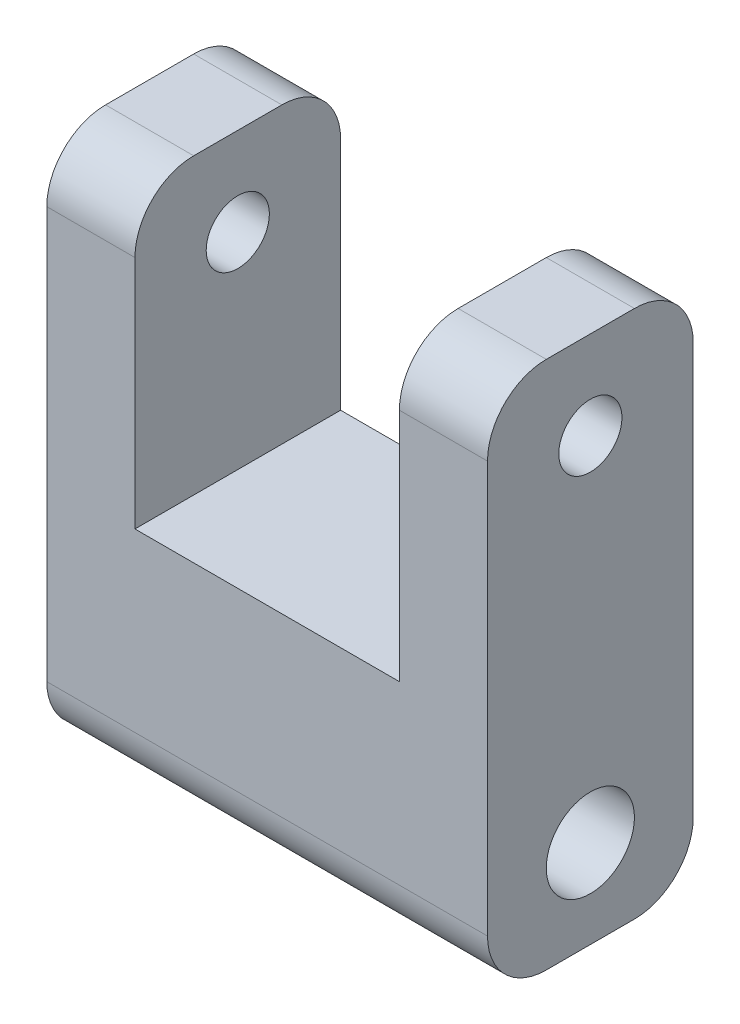
ISO-10303-21;
HEADER;
FILE_DESCRIPTION(('STEP AP214'),'2;1');
FILE_NAME('part.step','',(''),(''),'','','');
FILE_SCHEMA(('AUTOMOTIVE_DESIGN { 1 0 10303 214 1 1 1 1 }'));
ENDSEC;
DATA;
#1=APPLICATION_CONTEXT('core data for automotive mechanical design processes');
#2=APPLICATION_PROTOCOL_DEFINITION('international standard','automotive_design',2000,#1);
#3=PRODUCT_CONTEXT('',#1,'mechanical');
#4=PRODUCT('Part','Part','',(#3));
#5=PRODUCT_RELATED_PRODUCT_CATEGORY('part','',(#4));
#6=PRODUCT_DEFINITION_FORMATION('','',#4);
#7=PRODUCT_DEFINITION_CONTEXT('part definition',#1,'design');
#8=PRODUCT_DEFINITION('design','',#6,#7);
#9=PRODUCT_DEFINITION_SHAPE('','',#8);
#10=(LENGTH_UNIT() NAMED_UNIT(*) SI_UNIT(.MILLI.,.METRE.));
#11=(NAMED_UNIT(*) PLANE_ANGLE_UNIT() SI_UNIT($,.RADIAN.));
#12=(NAMED_UNIT(*) SI_UNIT($,.STERADIAN.) SOLID_ANGLE_UNIT());
#13=UNCERTAINTY_MEASURE_WITH_UNIT(LENGTH_MEASURE(1.E-05),#10,'distance_accuracy_value','');
#14=(GEOMETRIC_REPRESENTATION_CONTEXT(3) GLOBAL_UNCERTAINTY_ASSIGNED_CONTEXT((#13)) GLOBAL_UNIT_ASSIGNED_CONTEXT((#10,
#11,#12)) REPRESENTATION_CONTEXT('',''));
#15=CARTESIAN_POINT('',(0.,0.,0.));
#16=DIRECTION('',(0.,0.,1.));
#17=DIRECTION('',(1.,0.,0.));
#18=AXIS2_PLACEMENT_3D('',#15,#16,#17);
#19=CARTESIAN_POINT('',(0.,16.,6.));
#20=DIRECTION('',(1.,0.,0.));
#21=DIRECTION('',(0.,0.,-1.));
#22=AXIS2_PLACEMENT_3D('',#19,#20,#21);
#23=CYLINDRICAL_SURFACE('',#22,2.);
#24=DIRECTION('',(1.,0.,0.));
#25=VECTOR('',#24,1.);
#26=CARTESIAN_POINT('',(0.,16.,4.));
#27=LINE('',#26,#25);
#28=CARTESIAN_POINT('',(0.,16.,4.));
#29=VERTEX_POINT('',#28);
#30=CARTESIAN_POINT('',(3.,16.,4.));
#31=VERTEX_POINT('',#30);
#32=EDGE_CURVE('E259',#29,#31,#27,.T.);
#33=ORIENTED_EDGE('',*,*,#32,.F.);
#34=CARTESIAN_POINT('',(0.,16.,6.));
#35=DIRECTION('',(1.,0.,0.));
#36=DIRECTION('',(0.,0.,-1.));
#37=AXIS2_PLACEMENT_3D('',#34,#35,#36);
#38=CIRCLE('',#37,2.);
#39=CARTESIAN_POINT('',(0.,18.,6.));
#40=VERTEX_POINT('',#39);
#41=EDGE_CURVE('E42',#40,#29,#38,.F.);
#42=ORIENTED_EDGE('',*,*,#41,.F.);
#43=DIRECTION('',(1.,0.,0.));
#44=VECTOR('',#43,1.);
#45=CARTESIAN_POINT('',(0.,18.,6.));
#46=LINE('',#45,#44);
#47=CARTESIAN_POINT('',(3.,18.,6.));
#48=VERTEX_POINT('',#47);
#49=EDGE_CURVE('E262',#48,#40,#46,.F.);
#50=ORIENTED_EDGE('',*,*,#49,.F.);
#51=CARTESIAN_POINT('',(3.,16.,6.));
#52=DIRECTION('',(-1.,0.,0.));
#53=DIRECTION('',(0.,-1.,0.));
#54=AXIS2_PLACEMENT_3D('',#51,#52,#53);
#55=CIRCLE('',#54,2.);
#56=EDGE_CURVE('E11',#31,#48,#55,.F.);
#57=ORIENTED_EDGE('',*,*,#56,.F.);
#58=EDGE_LOOP('',(#33,#42,#50,#57));
#59=FACE_BOUND('',#58,.T.);
#60=ADVANCED_FACE('F35',(#59),#23,.T.);
#61=CARTESIAN_POINT('',(0.,16.,6.));
#62=DIRECTION('',(1.,0.,0.));
#63=DIRECTION('',(0.,0.,-1.));
#64=AXIS2_PLACEMENT_3D('',#61,#62,#63);
#65=CYLINDRICAL_SURFACE('',#64,2.);
#66=DIRECTION('',(1.,0.,0.));
#67=VECTOR('',#66,1.);
#68=CARTESIAN_POINT('',(0.,16.,4.));
#69=LINE('',#68,#67);
#70=CARTESIAN_POINT('',(12.,16.,4.));
#71=VERTEX_POINT('',#70);
#72=CARTESIAN_POINT('',(15.,16.,4.));
#73=VERTEX_POINT('',#72);
#74=EDGE_CURVE('E249',#71,#73,#69,.T.);
#75=ORIENTED_EDGE('',*,*,#74,.F.);
#76=CARTESIAN_POINT('',(12.,16.,6.));
#77=DIRECTION('',(1.,0.,0.));
#78=DIRECTION('',(0.,0.,-1.));
#79=AXIS2_PLACEMENT_3D('',#76,#77,#78);
#80=CIRCLE('',#79,2.);
#81=CARTESIAN_POINT('',(12.,18.,6.));
#82=VERTEX_POINT('',#81);
#83=EDGE_CURVE('E255',#82,#71,#80,.F.);
#84=ORIENTED_EDGE('',*,*,#83,.F.);
#85=DIRECTION('',(1.,0.,0.));
#86=VECTOR('',#85,1.);
#87=CARTESIAN_POINT('',(0.,18.,6.));
#88=LINE('',#87,#86);
#89=CARTESIAN_POINT('',(15.,18.,6.));
#90=VERTEX_POINT('',#89);
#91=EDGE_CURVE('E252',#90,#82,#88,.F.);
#92=ORIENTED_EDGE('',*,*,#91,.F.);
#93=CARTESIAN_POINT('',(15.,16.,6.));
#94=DIRECTION('',(-1.,0.,0.));
#95=DIRECTION('',(0.,-1.,0.));
#96=AXIS2_PLACEMENT_3D('',#93,#94,#95);
#97=CIRCLE('',#96,2.);
#98=EDGE_CURVE('E257',#73,#90,#97,.F.);
#99=ORIENTED_EDGE('',*,*,#98,.F.);
#100=EDGE_LOOP('',(#75,#84,#92,#99));
#101=FACE_BOUND('',#100,.T.);
#102=ADVANCED_FACE('F308',(#101),#65,.T.);
#103=CARTESIAN_POINT('',(0.,16.,9.));
#104=DIRECTION('',(-1.,0.,0.));
#105=DIRECTION('',(0.,0.,1.));
#106=AXIS2_PLACEMENT_3D('',#103,#104,#105);
#107=CYLINDRICAL_SURFACE('',#106,2.);
#108=DIRECTION('',(-1.,0.,0.));
#109=VECTOR('',#108,1.);
#110=CARTESIAN_POINT('',(0.,16.,11.));
#111=LINE('',#110,#109);
#112=CARTESIAN_POINT('',(15.,16.,11.));
#113=VERTEX_POINT('',#112);
#114=CARTESIAN_POINT('',(12.,16.,11.));
#115=VERTEX_POINT('',#114);
#116=EDGE_CURVE('E239',#113,#115,#111,.T.);
#117=ORIENTED_EDGE('',*,*,#116,.F.);
#118=CARTESIAN_POINT('',(15.,16.,9.));
#119=DIRECTION('',(-1.,0.,0.));
#120=DIRECTION('',(0.,-1.,0.));
#121=AXIS2_PLACEMENT_3D('',#118,#119,#120);
#122=CIRCLE('',#121,2.);
#123=CARTESIAN_POINT('',(15.,18.,9.));
#124=VERTEX_POINT('',#123);
#125=EDGE_CURVE('E244',#124,#113,#122,.F.);
#126=ORIENTED_EDGE('',*,*,#125,.F.);
#127=DIRECTION('',(-1.,0.,0.));
#128=VECTOR('',#127,1.);
#129=CARTESIAN_POINT('',(0.,18.,9.));
#130=LINE('',#129,#128);
#131=CARTESIAN_POINT('',(12.,18.,9.));
#132=VERTEX_POINT('',#131);
#133=EDGE_CURVE('E241',#132,#124,#130,.F.);
#134=ORIENTED_EDGE('',*,*,#133,.F.);
#135=CARTESIAN_POINT('',(12.,16.,9.));
#136=DIRECTION('',(1.,0.,0.));
#137=DIRECTION('',(0.,0.,-1.));
#138=AXIS2_PLACEMENT_3D('',#135,#136,#137);
#139=CIRCLE('',#138,2.);
#140=EDGE_CURVE('E246',#115,#132,#139,.F.);
#141=ORIENTED_EDGE('',*,*,#140,.F.);
#142=EDGE_LOOP('',(#117,#126,#134,#141));
#143=FACE_BOUND('',#142,.T.);
#144=ADVANCED_FACE('F313',(#143),#107,.T.);
#145=CARTESIAN_POINT('',(0.,16.,9.));
#146=DIRECTION('',(1.,0.,0.));
#147=DIRECTION('',(0.,0.,-1.));
#148=AXIS2_PLACEMENT_3D('',#145,#146,#147);
#149=CYLINDRICAL_SURFACE('',#148,2.);
#150=DIRECTION('',(1.,0.,0.));
#151=VECTOR('',#150,1.);
#152=CARTESIAN_POINT('',(0.,18.,9.));
#153=LINE('',#152,#151);
#154=CARTESIAN_POINT('',(0.,18.,9.));
#155=VERTEX_POINT('',#154);
#156=CARTESIAN_POINT('',(3.,18.,9.));
#157=VERTEX_POINT('',#156);
#158=EDGE_CURVE('E231',#155,#157,#153,.T.);
#159=ORIENTED_EDGE('',*,*,#158,.F.);
#160=CARTESIAN_POINT('',(0.,16.,9.));
#161=DIRECTION('',(1.,0.,0.));
#162=DIRECTION('',(0.,0.,-1.));
#163=AXIS2_PLACEMENT_3D('',#160,#161,#162);
#164=CIRCLE('',#163,2.);
#165=CARTESIAN_POINT('',(0.,16.,11.));
#166=VERTEX_POINT('',#165);
#167=EDGE_CURVE('E237',#166,#155,#164,.F.);
#168=ORIENTED_EDGE('',*,*,#167,.F.);
#169=DIRECTION('',(1.,0.,0.));
#170=VECTOR('',#169,1.);
#171=CARTESIAN_POINT('',(0.,16.,11.));
#172=LINE('',#171,#170);
#173=CARTESIAN_POINT('',(3.,16.,11.));
#174=VERTEX_POINT('',#173);
#175=EDGE_CURVE('E235',#174,#166,#172,.F.);
#176=ORIENTED_EDGE('',*,*,#175,.F.);
#177=CARTESIAN_POINT('',(3.,16.,9.));
#178=DIRECTION('',(-1.,0.,0.));
#179=DIRECTION('',(0.,-1.,0.));
#180=AXIS2_PLACEMENT_3D('',#177,#178,#179);
#181=CIRCLE('',#180,2.);
#182=EDGE_CURVE('E137',#157,#174,#181,.F.);
#183=ORIENTED_EDGE('',*,*,#182,.F.);
#184=EDGE_LOOP('',(#159,#168,#176,#183));
#185=FACE_BOUND('',#184,.T.);
#186=ADVANCED_FACE('F287',(#185),#149,.T.);
#187=CARTESIAN_POINT('',(0.,2.,6.));
#188=DIRECTION('',(-1.,0.,0.));
#189=DIRECTION('',(0.,0.,1.));
#190=AXIS2_PLACEMENT_3D('',#187,#188,#189);
#191=CYLINDRICAL_SURFACE('',#190,2.);
#192=DIRECTION('',(-1.,0.,0.));
#193=VECTOR('',#192,1.);
#194=CARTESIAN_POINT('',(0.,2.,4.));
#195=LINE('',#194,#193);
#196=CARTESIAN_POINT('',(15.,2.,4.));
#197=VERTEX_POINT('',#196);
#198=CARTESIAN_POINT('',(0.,2.,4.));
#199=VERTEX_POINT('',#198);
#200=EDGE_CURVE('E220',#197,#199,#195,.T.);
#201=ORIENTED_EDGE('',*,*,#200,.F.);
#202=CARTESIAN_POINT('',(15.,2.,6.));
#203=DIRECTION('',(-1.,0.,0.));
#204=DIRECTION('',(0.,-1.,0.));
#205=AXIS2_PLACEMENT_3D('',#202,#203,#204);
#206=CIRCLE('',#205,2.);
#207=CARTESIAN_POINT('',(15.,0.,6.));
#208=VERTEX_POINT('',#207);
#209=EDGE_CURVE('E226',#208,#197,#206,.F.);
#210=ORIENTED_EDGE('',*,*,#209,.F.);
#211=DIRECTION('',(-1.,0.,0.));
#212=VECTOR('',#211,1.);
#213=CARTESIAN_POINT('',(20.,0.,6.));
#214=LINE('',#213,#212);
#215=CARTESIAN_POINT('',(0.,0.,6.));
#216=VERTEX_POINT('',#215);
#217=EDGE_CURVE('E223',#216,#208,#214,.F.);
#218=ORIENTED_EDGE('',*,*,#217,.F.);
#219=CARTESIAN_POINT('',(0.,2.,6.));
#220=DIRECTION('',(1.,0.,0.));
#221=DIRECTION('',(0.,0.,-1.));
#222=AXIS2_PLACEMENT_3D('',#219,#220,#221);
#223=CIRCLE('',#222,2.);
#224=EDGE_CURVE('E229',#199,#216,#223,.F.);
#225=ORIENTED_EDGE('',*,*,#224,.F.);
#226=EDGE_LOOP('',(#201,#210,#218,#225));
#227=FACE_BOUND('',#226,.T.);
#228=ADVANCED_FACE('F273',(#227),#191,.T.);
#229=CARTESIAN_POINT('',(0.,2.,9.));
#230=DIRECTION('',(1.,0.,0.));
#231=DIRECTION('',(0.,0.,-1.));
#232=AXIS2_PLACEMENT_3D('',#229,#230,#231);
#233=CYLINDRICAL_SURFACE('',#232,2.);
#234=DIRECTION('',(1.,0.,0.));
#235=VECTOR('',#234,1.);
#236=CARTESIAN_POINT('',(0.,2.,11.));
#237=LINE('',#236,#235);
#238=CARTESIAN_POINT('',(0.,2.,11.));
#239=VERTEX_POINT('',#238);
#240=CARTESIAN_POINT('',(15.,2.,11.));
#241=VERTEX_POINT('',#240);
#242=EDGE_CURVE('E203',#239,#241,#237,.T.);
#243=ORIENTED_EDGE('',*,*,#242,.F.);
#244=CARTESIAN_POINT('',(0.,2.,9.));
#245=DIRECTION('',(1.,0.,0.));
#246=DIRECTION('',(0.,0.,-1.));
#247=AXIS2_PLACEMENT_3D('',#244,#245,#246);
#248=CIRCLE('',#247,2.);
#249=CARTESIAN_POINT('',(0.,0.,9.));
#250=VERTEX_POINT('',#249);
#251=EDGE_CURVE('E215',#250,#239,#248,.F.);
#252=ORIENTED_EDGE('',*,*,#251,.F.);
#253=DIRECTION('',(1.,0.,0.));
#254=VECTOR('',#253,1.);
#255=CARTESIAN_POINT('',(20.,0.,9.));
#256=LINE('',#255,#254);
#257=CARTESIAN_POINT('',(15.,0.,9.));
#258=VERTEX_POINT('',#257);
#259=EDGE_CURVE('E212',#258,#250,#256,.F.);
#260=ORIENTED_EDGE('',*,*,#259,.F.);
#261=CARTESIAN_POINT('',(15.,2.,9.));
#262=DIRECTION('',(-1.,0.,0.));
#263=DIRECTION('',(0.,-1.,0.));
#264=AXIS2_PLACEMENT_3D('',#261,#262,#263);
#265=CIRCLE('',#264,2.);
#266=EDGE_CURVE('E217',#241,#258,#265,.F.);
#267=ORIENTED_EDGE('',*,*,#266,.F.);
#268=EDGE_LOOP('',(#243,#252,#260,#267));
#269=FACE_BOUND('',#268,.T.);
#270=ADVANCED_FACE('F283',(#269),#233,.T.);
#271=CARTESIAN_POINT('',(0.,18.,15.));
#272=DIRECTION('',(0.,-1.,0.));
#273=DIRECTION('',(0.,0.,-1.));
#274=AXIS2_PLACEMENT_3D('',#271,#272,#273);
#275=PLANE('',#274);
#276=DIRECTION('',(0.,0.,1.));
#277=VECTOR('',#276,1.);
#278=CARTESIAN_POINT('',(15.,18.,-9.));
#279=LINE('',#278,#277);
#280=EDGE_CURVE('E176',#90,#124,#279,.T.);
#281=ORIENTED_EDGE('',*,*,#280,.F.);
#282=ORIENTED_EDGE('',*,*,#91,.T.);
#283=DIRECTION('',(0.,0.,1.));
#284=VECTOR('',#283,1.);
#285=CARTESIAN_POINT('',(12.,18.,-9.));
#286=LINE('',#285,#284);
#287=EDGE_CURVE('E162',#82,#132,#286,.T.);
#288=ORIENTED_EDGE('',*,*,#287,.T.);
#289=ORIENTED_EDGE('',*,*,#133,.T.);
#290=EDGE_LOOP('',(#281,#282,#288,#289));
#291=FACE_BOUND('',#290,.T.);
#292=ADVANCED_FACE('F293',(#291),#275,.F.);
#293=CARTESIAN_POINT('',(0.,15.,7.5));
#294=DIRECTION('',(1.,0.,0.));
#295=DIRECTION('',(0.,1.,0.));
#296=AXIS2_PLACEMENT_3D('',#293,#294,#295);
#297=CYLINDRICAL_SURFACE('',#296,1.075);
#298=CARTESIAN_POINT('',(12.,15.,7.5));
#299=DIRECTION('',(1.,0.,0.));
#300=DIRECTION('',(0.,0.,-1.));
#301=AXIS2_PLACEMENT_3D('',#298,#299,#300);
#302=CIRCLE('',#301,1.075);
#303=CARTESIAN_POINT('',(12.,15.,6.425));
#304=VERTEX_POINT('',#303);
#305=EDGE_CURVE('E169',#304,#304,#302,.F.);
#306=ORIENTED_EDGE('',*,*,#305,.T.);
#307=EDGE_LOOP('',(#306));
#308=FACE_BOUND('',#307,.T.);
#309=CARTESIAN_POINT('',(15.,15.,7.5));
#310=DIRECTION('',(-1.,0.,0.));
#311=DIRECTION('',(0.,-1.,0.));
#312=AXIS2_PLACEMENT_3D('',#309,#310,#311);
#313=CIRCLE('',#312,1.075);
#314=CARTESIAN_POINT('',(15.,13.925,7.5));
#315=VERTEX_POINT('',#314);
#316=EDGE_CURVE('E179',#315,#315,#313,.F.);
#317=ORIENTED_EDGE('',*,*,#316,.T.);
#318=EDGE_LOOP('',(#317));
#319=FACE_BOUND('',#318,.T.);
#320=ADVANCED_FACE('F303',(#308,#319),#297,.F.);
#321=CARTESIAN_POINT('',(20.,0.,15.));
#322=DIRECTION('',(0.,1.,0.));
#323=DIRECTION('',(0.,0.,1.));
#324=AXIS2_PLACEMENT_3D('',#321,#322,#323);
#325=PLANE('',#324);
#326=DIRECTION('',(0.,0.,-1.));
#327=VECTOR('',#326,1.);
#328=CARTESIAN_POINT('',(0.,0.,15.));
#329=LINE('',#328,#327);
#330=EDGE_CURVE('E197',#250,#216,#329,.T.);
#331=ORIENTED_EDGE('',*,*,#330,.T.);
#332=ORIENTED_EDGE('',*,*,#217,.T.);
#333=DIRECTION('',(0.,0.,1.));
#334=VECTOR('',#333,1.);
#335=CARTESIAN_POINT('',(15.,0.,-9.));
#336=LINE('',#335,#334);
#337=EDGE_CURVE('E177',#208,#258,#336,.T.);
#338=ORIENTED_EDGE('',*,*,#337,.T.);
#339=ORIENTED_EDGE('',*,*,#259,.T.);
#340=EDGE_LOOP('',(#331,#332,#338,#339));
#341=FACE_BOUND('',#340,.T.);
#342=ADVANCED_FACE('F278',(#341),#325,.F.);
#343=DIRECTION('',(0.,0.,1.));
#344=VECTOR('',#343,1.);
#345=CARTESIAN_POINT('',(3.,18.,-9.));
#346=LINE('',#345,#344);
#347=EDGE_CURVE('E152',#48,#157,#346,.T.);
#348=ORIENTED_EDGE('',*,*,#347,.F.);
#349=ORIENTED_EDGE('',*,*,#49,.T.);
#350=DIRECTION('',(0.,0.,-1.));
#351=VECTOR('',#350,1.);
#352=CARTESIAN_POINT('',(0.,18.,15.));
#353=LINE('',#352,#351);
#354=EDGE_CURVE('E200',#155,#40,#353,.T.);
#355=ORIENTED_EDGE('',*,*,#354,.F.);
#356=ORIENTED_EDGE('',*,*,#158,.T.);
#357=EDGE_LOOP('',(#348,#349,#355,#356));
#358=FACE_BOUND('',#357,.T.);
#359=ADVANCED_FACE('F290',(#358),#275,.F.);
#360=CARTESIAN_POINT('',(0.,0.,15.));
#361=DIRECTION('',(1.,0.,0.));
#362=DIRECTION('',(0.,0.,-1.));
#363=AXIS2_PLACEMENT_3D('',#360,#361,#362);
#364=PLANE('',#363);
#365=CARTESIAN_POINT('',(0.,15.,7.5));
#366=DIRECTION('',(1.,0.,0.));
#367=DIRECTION('',(0.,1.,0.));
#368=AXIS2_PLACEMENT_3D('',#365,#366,#367);
#369=CIRCLE('',#368,1.075);
#370=CARTESIAN_POINT('',(0.,16.075,7.5));
#371=VERTEX_POINT('',#370);
#372=EDGE_CURVE('E186',#371,#371,#369,.T.);
#373=ORIENTED_EDGE('',*,*,#372,.T.);
#374=EDGE_LOOP('',(#373));
#375=FACE_BOUND('',#374,.T.);
#376=CARTESIAN_POINT('',(0.,3.,7.5));
#377=DIRECTION('',(1.,0.,0.));
#378=DIRECTION('',(0.,1.,0.));
#379=AXIS2_PLACEMENT_3D('',#376,#377,#378);
#380=CIRCLE('',#379,1.5);
#381=CARTESIAN_POINT('',(0.,4.5,7.5));
#382=VERTEX_POINT('',#381);
#383=EDGE_CURVE('E193',#382,#382,#380,.T.);
#384=ORIENTED_EDGE('',*,*,#383,.T.);
#385=EDGE_LOOP('',(#384));
#386=FACE_BOUND('',#385,.T.);
#387=ORIENTED_EDGE('',*,*,#354,.T.);
#388=ORIENTED_EDGE('',*,*,#41,.T.);
#389=DIRECTION('',(0.,-1.,0.));
#390=VECTOR('',#389,1.);
#391=CARTESIAN_POINT('',(0.,0.,4.));
#392=LINE('',#391,#390);
#393=EDGE_CURVE('E189',#29,#199,#392,.T.);
#394=ORIENTED_EDGE('',*,*,#393,.T.);
#395=ORIENTED_EDGE('',*,*,#224,.T.);
#396=ORIENTED_EDGE('',*,*,#330,.F.);
#397=ORIENTED_EDGE('',*,*,#251,.T.);
#398=DIRECTION('',(0.,1.,0.));
#399=VECTOR('',#398,1.);
#400=CARTESIAN_POINT('',(0.,0.,11.));
#401=LINE('',#400,#399);
#402=EDGE_CURVE('E190',#239,#166,#401,.T.);
#403=ORIENTED_EDGE('',*,*,#402,.T.);
#404=ORIENTED_EDGE('',*,*,#167,.T.);
#405=EDGE_LOOP('',(#387,#388,#394,#395,#396,#397,#403,#404));
#406=FACE_BOUND('',#405,.T.);
#407=ADVANCED_FACE('F264',(#375,#386,#406),#364,.F.);
#408=CARTESIAN_POINT('',(0.,3.,7.5));
#409=DIRECTION('',(1.,0.,0.));
#410=DIRECTION('',(0.,1.,0.));
#411=AXIS2_PLACEMENT_3D('',#408,#409,#410);
#412=CYLINDRICAL_SURFACE('',#411,1.5);
#413=CARTESIAN_POINT('',(15.,3.,7.5));
#414=DIRECTION('',(-1.,0.,0.));
#415=DIRECTION('',(0.,-1.,0.));
#416=AXIS2_PLACEMENT_3D('',#413,#414,#415);
#417=CIRCLE('',#416,1.5);
#418=CARTESIAN_POINT('',(15.,1.5,7.5));
#419=VERTEX_POINT('',#418);
#420=EDGE_CURVE('E183',#419,#419,#417,.F.);
#421=ORIENTED_EDGE('',*,*,#420,.T.);
#422=EDGE_LOOP('',(#421));
#423=FACE_BOUND('',#422,.T.);
#424=ORIENTED_EDGE('',*,*,#383,.F.);
#425=EDGE_LOOP('',(#424));
#426=FACE_BOUND('',#425,.T.);
#427=ADVANCED_FACE('F299',(#423,#426),#412,.F.);
#428=CARTESIAN_POINT('',(0.,0.,4.));
#429=DIRECTION('',(0.,0.,1.));
#430=DIRECTION('',(1.,0.,0.));
#431=AXIS2_PLACEMENT_3D('',#428,#429,#430);
#432=PLANE('',#431);
#433=ORIENTED_EDGE('',*,*,#393,.F.);
#434=ORIENTED_EDGE('',*,*,#32,.T.);
#435=DIRECTION('',(0.,-1.,0.));
#436=VECTOR('',#435,1.);
#437=CARTESIAN_POINT('',(3.,0.,4.));
#438=LINE('',#437,#436);
#439=CARTESIAN_POINT('',(3.,7.99999999999999,4.));
#440=VERTEX_POINT('',#439);
#441=EDGE_CURVE('E167',#31,#440,#438,.T.);
#442=ORIENTED_EDGE('',*,*,#441,.T.);
#443=DIRECTION('',(1.,0.,0.));
#444=VECTOR('',#443,1.);
#445=CARTESIAN_POINT('',(0.,7.99999999999999,4.));
#446=LINE('',#445,#444);
#447=CARTESIAN_POINT('',(12.,7.99999999999999,4.));
#448=VERTEX_POINT('',#447);
#449=EDGE_CURVE('E150',#440,#448,#446,.T.);
#450=ORIENTED_EDGE('',*,*,#449,.T.);
#451=DIRECTION('',(0.,1.,0.));
#452=VECTOR('',#451,1.);
#453=CARTESIAN_POINT('',(12.,0.,4.));
#454=LINE('',#453,#452);
#455=EDGE_CURVE('E170',#448,#71,#454,.T.);
#456=ORIENTED_EDGE('',*,*,#455,.T.);
#457=ORIENTED_EDGE('',*,*,#74,.T.);
#458=DIRECTION('',(0.,-1.,0.));
#459=VECTOR('',#458,1.);
#460=CARTESIAN_POINT('',(15.,0.,4.));
#461=LINE('',#460,#459);
#462=EDGE_CURVE('E181',#73,#197,#461,.T.);
#463=ORIENTED_EDGE('',*,*,#462,.T.);
#464=ORIENTED_EDGE('',*,*,#200,.T.);
#465=EDGE_LOOP('',(#433,#434,#442,#450,#456,#457,#463,#464));
#466=FACE_BOUND('',#465,.T.);
#467=ADVANCED_FACE('F269',(#466),#432,.F.);
#468=CARTESIAN_POINT('',(0.,0.,11.));
#469=DIRECTION('',(0.,0.,-1.));
#470=DIRECTION('',(-1.,0.,0.));
#471=AXIS2_PLACEMENT_3D('',#468,#469,#470);
#472=PLANE('',#471);
#473=DIRECTION('',(0.,-1.,0.));
#474=VECTOR('',#473,1.);
#475=CARTESIAN_POINT('',(15.,18.,11.));
#476=LINE('',#475,#474);
#477=EDGE_CURVE('E174',#113,#241,#476,.T.);
#478=ORIENTED_EDGE('',*,*,#477,.F.);
#479=ORIENTED_EDGE('',*,*,#116,.T.);
#480=DIRECTION('',(0.,1.,0.));
#481=VECTOR('',#480,1.);
#482=CARTESIAN_POINT('',(12.,7.99999999999999,11.));
#483=LINE('',#482,#481);
#484=CARTESIAN_POINT('',(12.,7.99999999999999,11.));
#485=VERTEX_POINT('',#484);
#486=EDGE_CURVE('E158',#485,#115,#483,.T.);
#487=ORIENTED_EDGE('',*,*,#486,.F.);
#488=DIRECTION('',(1.,0.,0.));
#489=VECTOR('',#488,1.);
#490=CARTESIAN_POINT('',(3.,7.99999999999999,11.));
#491=LINE('',#490,#489);
#492=CARTESIAN_POINT('',(3.,7.99999999999999,11.));
#493=VERTEX_POINT('',#492);
#494=EDGE_CURVE('E141',#493,#485,#491,.T.);
#495=ORIENTED_EDGE('',*,*,#494,.F.);
#496=DIRECTION('',(0.,-1.,0.));
#497=VECTOR('',#496,1.);
#498=CARTESIAN_POINT('',(3.,18.,11.));
#499=LINE('',#498,#497);
#500=EDGE_CURVE('E132',#174,#493,#499,.T.);
#501=ORIENTED_EDGE('',*,*,#500,.F.);
#502=ORIENTED_EDGE('',*,*,#175,.T.);
#503=ORIENTED_EDGE('',*,*,#402,.F.);
#504=ORIENTED_EDGE('',*,*,#242,.T.);
#505=EDGE_LOOP('',(#478,#479,#487,#495,#501,#502,#503,#504));
#506=FACE_BOUND('',#505,.T.);
#507=ADVANCED_FACE('F155',(#506),#472,.F.);
#508=CARTESIAN_POINT('',(3.,15.,7.5));
#509=DIRECTION('',(-1.,0.,0.));
#510=DIRECTION('',(0.,-1.,0.));
#511=AXIS2_PLACEMENT_3D('',#508,#509,#510);
#512=CIRCLE('',#511,1.075);
#513=CARTESIAN_POINT('',(3.,13.925,7.5));
#514=VERTEX_POINT('',#513);
#515=EDGE_CURVE('E164',#514,#514,#512,.F.);
#516=ORIENTED_EDGE('',*,*,#515,.T.);
#517=EDGE_LOOP('',(#516));
#518=FACE_BOUND('',#517,.T.);
#519=ORIENTED_EDGE('',*,*,#372,.F.);
#520=EDGE_LOOP('',(#519));
#521=FACE_BOUND('',#520,.T.);
#522=ADVANCED_FACE('F343',(#518,#521),#297,.F.);
#523=CARTESIAN_POINT('',(15.,18.,-9.));
#524=DIRECTION('',(-1.,0.,0.));
#525=DIRECTION('',(0.,-1.,0.));
#526=AXIS2_PLACEMENT_3D('',#523,#524,#525);
#527=PLANE('',#526);
#528=ORIENTED_EDGE('',*,*,#462,.F.);
#529=ORIENTED_EDGE('',*,*,#98,.T.);
#530=ORIENTED_EDGE('',*,*,#280,.T.);
#531=ORIENTED_EDGE('',*,*,#125,.T.);
#532=ORIENTED_EDGE('',*,*,#477,.T.);
#533=ORIENTED_EDGE('',*,*,#266,.T.);
#534=ORIENTED_EDGE('',*,*,#337,.F.);
#535=ORIENTED_EDGE('',*,*,#209,.T.);
#536=EDGE_LOOP('',(#528,#529,#530,#531,#532,#533,#534,#535));
#537=FACE_BOUND('',#536,.T.);
#538=ORIENTED_EDGE('',*,*,#316,.F.);
#539=EDGE_LOOP('',(#538));
#540=FACE_BOUND('',#539,.T.);
#541=ORIENTED_EDGE('',*,*,#420,.F.);
#542=EDGE_LOOP('',(#541));
#543=FACE_BOUND('',#542,.T.);
#544=ADVANCED_FACE('F356',(#537,#540,#543),#527,.F.);
#545=CARTESIAN_POINT('',(3.,7.99999999999999,-9.));
#546=DIRECTION('',(0.,-1.,0.));
#547=DIRECTION('',(0.,0.,-1.));
#548=AXIS2_PLACEMENT_3D('',#545,#546,#547);
#549=PLANE('',#548);
#550=DIRECTION('',(0.,0.,1.));
#551=VECTOR('',#550,1.);
#552=CARTESIAN_POINT('',(3.,7.99999999999999,-9.));
#553=LINE('',#552,#551);
#554=EDGE_CURVE('E135',#440,#493,#553,.T.);
#555=ORIENTED_EDGE('',*,*,#554,.T.);
#556=ORIENTED_EDGE('',*,*,#494,.T.);
#557=DIRECTION('',(0.,0.,1.));
#558=VECTOR('',#557,1.);
#559=CARTESIAN_POINT('',(12.,7.99999999999999,-9.));
#560=LINE('',#559,#558);
#561=EDGE_CURVE('E151',#448,#485,#560,.T.);
#562=ORIENTED_EDGE('',*,*,#561,.F.);
#563=ORIENTED_EDGE('',*,*,#449,.F.);
#564=EDGE_LOOP('',(#555,#556,#562,#563));
#565=FACE_BOUND('',#564,.T.);
#566=ADVANCED_FACE('F146',(#565),#549,.F.);
#567=CARTESIAN_POINT('',(12.,7.99999999999999,-9.));
#568=DIRECTION('',(1.,0.,0.));
#569=DIRECTION('',(0.,0.,-1.));
#570=AXIS2_PLACEMENT_3D('',#567,#568,#569);
#571=PLANE('',#570);
#572=ORIENTED_EDGE('',*,*,#305,.F.);
#573=EDGE_LOOP('',(#572));
#574=FACE_BOUND('',#573,.T.);
#575=ORIENTED_EDGE('',*,*,#287,.F.);
#576=ORIENTED_EDGE('',*,*,#83,.T.);
#577=ORIENTED_EDGE('',*,*,#455,.F.);
#578=ORIENTED_EDGE('',*,*,#561,.T.);
#579=ORIENTED_EDGE('',*,*,#486,.T.);
#580=ORIENTED_EDGE('',*,*,#140,.T.);
#581=EDGE_LOOP('',(#575,#576,#577,#578,#579,#580));
#582=FACE_BOUND('',#581,.T.);
#583=ADVANCED_FACE('F367',(#574,#582),#571,.F.);
#584=CARTESIAN_POINT('',(3.,18.,-9.));
#585=DIRECTION('',(-1.,0.,0.));
#586=DIRECTION('',(0.,-1.,0.));
#587=AXIS2_PLACEMENT_3D('',#584,#585,#586);
#588=PLANE('',#587);
#589=ORIENTED_EDGE('',*,*,#515,.F.);
#590=EDGE_LOOP('',(#589));
#591=FACE_BOUND('',#590,.T.);
#592=ORIENTED_EDGE('',*,*,#441,.F.);
#593=ORIENTED_EDGE('',*,*,#56,.T.);
#594=ORIENTED_EDGE('',*,*,#347,.T.);
#595=ORIENTED_EDGE('',*,*,#182,.T.);
#596=ORIENTED_EDGE('',*,*,#500,.T.);
#597=ORIENTED_EDGE('',*,*,#554,.F.);
#598=EDGE_LOOP('',(#592,#593,#594,#595,#596,#597));
#599=FACE_BOUND('',#598,.T.);
#600=ADVANCED_FACE('F134',(#591,#599),#588,.F.);
#601=CLOSED_SHELL('',(#60,#102,#144,#186,#228,#270,#292,#320,#342,#359,#407,#427,#467,#507,#522,
#544,#566,#583,#600));
#602=MANIFOLD_SOLID_BREP('B2',#601);
#603=ADVANCED_BREP_SHAPE_REPRESENTATION('',(#18,#602),#14);
#604=SHAPE_DEFINITION_REPRESENTATION(#9,#603);
ENDSEC;
END-ISO-10303-21;
